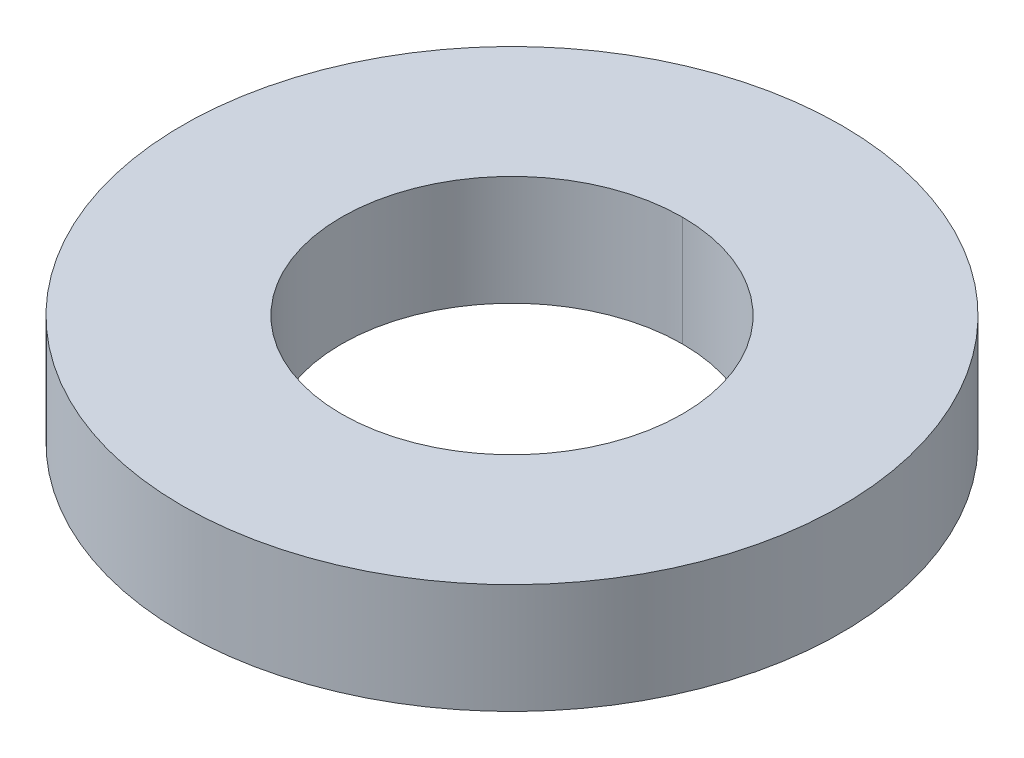
ISO-10303-21;
HEADER;
FILE_DESCRIPTION(('STEP AP214'),'2;1');
FILE_NAME('part.step','',(''),(''),'','','');
FILE_SCHEMA(('AUTOMOTIVE_DESIGN { 1 0 10303 214 1 1 1 1 }'));
ENDSEC;
DATA;
#1=APPLICATION_CONTEXT('core data for automotive mechanical design processes');
#2=APPLICATION_PROTOCOL_DEFINITION('international standard','automotive_design',2000,#1);
#3=PRODUCT_CONTEXT('',#1,'mechanical');
#4=PRODUCT('Part','Part','',(#3));
#5=PRODUCT_RELATED_PRODUCT_CATEGORY('part','',(#4));
#6=PRODUCT_DEFINITION_FORMATION('','',#4);
#7=PRODUCT_DEFINITION_CONTEXT('part definition',#1,'design');
#8=PRODUCT_DEFINITION('design','',#6,#7);
#9=PRODUCT_DEFINITION_SHAPE('','',#8);
#10=(LENGTH_UNIT() NAMED_UNIT(*) SI_UNIT(.MILLI.,.METRE.));
#11=(NAMED_UNIT(*) PLANE_ANGLE_UNIT() SI_UNIT($,.RADIAN.));
#12=(NAMED_UNIT(*) SI_UNIT($,.STERADIAN.) SOLID_ANGLE_UNIT());
#13=UNCERTAINTY_MEASURE_WITH_UNIT(LENGTH_MEASURE(1.E-05),#10,'distance_accuracy_value','');
#14=(GEOMETRIC_REPRESENTATION_CONTEXT(3) GLOBAL_UNCERTAINTY_ASSIGNED_CONTEXT((#13)) GLOBAL_UNIT_ASSIGNED_CONTEXT((#10,
#11,#12)) REPRESENTATION_CONTEXT('',''));
#15=CARTESIAN_POINT('',(0.,0.,0.));
#16=DIRECTION('',(0.,0.,1.));
#17=DIRECTION('',(1.,0.,0.));
#18=AXIS2_PLACEMENT_3D('',#15,#16,#17);
#19=CARTESIAN_POINT('',(0.,-1.5875,0.));
#20=DIRECTION('',(0.,1.,0.));
#21=DIRECTION('',(1.,0.,0.));
#22=AXIS2_PLACEMENT_3D('',#19,#20,#21);
#23=PLANE('',#22);
#24=CARTESIAN_POINT('',(0.,-1.5875,0.));
#25=DIRECTION('',(0.,1.,0.));
#26=DIRECTION('',(0.,0.,1.));
#27=AXIS2_PLACEMENT_3D('',#24,#25,#26);
#28=CIRCLE('',#27,2.4638);
#29=CARTESIAN_POINT('',(0.,-1.5875,-2.4638));
#30=VERTEX_POINT('',#29);
#31=CARTESIAN_POINT('',(0.,-1.5875,2.4638));
#32=VERTEX_POINT('',#31);
#33=EDGE_CURVE('E56',#30,#32,#28,.T.);
#34=ORIENTED_EDGE('',*,*,#33,.T.);
#35=CARTESIAN_POINT('',(0.,-1.5875,0.));
#36=DIRECTION('',(0.,1.,0.));
#37=DIRECTION('',(0.,0.,1.));
#38=AXIS2_PLACEMENT_3D('',#35,#36,#37);
#39=CIRCLE('',#38,2.4638);
#40=EDGE_CURVE('E93',#32,#30,#39,.T.);
#41=ORIENTED_EDGE('',*,*,#40,.T.);
#42=EDGE_LOOP('',(#34,#41));
#43=FACE_BOUND('',#42,.T.);
#44=CARTESIAN_POINT('',(0.,-1.5875,0.));
#45=DIRECTION('',(0.,1.,0.));
#46=DIRECTION('',(0.,0.,1.));
#47=AXIS2_PLACEMENT_3D('',#44,#45,#46);
#48=CIRCLE('',#47,4.7625);
#49=CARTESIAN_POINT('',(0.,-1.5875,4.7625));
#50=VERTEX_POINT('',#49);
#51=EDGE_CURVE('E88',#50,#50,#48,.T.);
#52=ORIENTED_EDGE('',*,*,#51,.F.);
#53=EDGE_LOOP('',(#52));
#54=FACE_BOUND('',#53,.T.);
#55=ADVANCED_FACE('F48',(#43,#54),#23,.F.);
#56=CARTESIAN_POINT('',(0.,1.5875,0.));
#57=DIRECTION('',(0.,-1.,0.));
#58=DIRECTION('',(0.,0.,-1.));
#59=AXIS2_PLACEMENT_3D('',#56,#57,#58);
#60=CYLINDRICAL_SURFACE('',#59,2.4638);
#61=DIRECTION('',(0.,-1.,0.));
#62=VECTOR('',#61,1.);
#63=CARTESIAN_POINT('',(0.,1.5875,2.4638));
#64=LINE('',#63,#62);
#65=CARTESIAN_POINT('',(0.,0.,2.4638));
#66=VERTEX_POINT('',#65);
#67=EDGE_CURVE('E72',#66,#32,#64,.T.);
#68=ORIENTED_EDGE('',*,*,#67,.F.);
#69=CARTESIAN_POINT('',(0.,0.,0.));
#70=DIRECTION('',(0.,-1.,0.));
#71=DIRECTION('',(0.,0.,-1.));
#72=AXIS2_PLACEMENT_3D('',#69,#70,#71);
#73=CIRCLE('',#72,2.4638);
#74=CARTESIAN_POINT('',(0.,0.,-2.4638));
#75=VERTEX_POINT('',#74);
#76=EDGE_CURVE('E62',#66,#75,#73,.F.);
#77=ORIENTED_EDGE('',*,*,#76,.T.);
#78=DIRECTION('',(0.,-1.,0.));
#79=VECTOR('',#78,1.);
#80=CARTESIAN_POINT('',(0.,1.5875,-2.4638));
#81=LINE('',#80,#79);
#82=EDGE_CURVE('E85',#75,#30,#81,.T.);
#83=ORIENTED_EDGE('',*,*,#82,.T.);
#84=ORIENTED_EDGE('',*,*,#40,.F.);
#85=EDGE_LOOP('',(#68,#77,#83,#84));
#86=FACE_BOUND('',#85,.T.);
#87=ADVANCED_FACE('F84',(#86),#60,.F.);
#88=CARTESIAN_POINT('',(0.,1.5875,0.));
#89=DIRECTION('',(0.,-1.,0.));
#90=DIRECTION('',(0.,0.,-1.));
#91=AXIS2_PLACEMENT_3D('',#88,#89,#90);
#92=CYLINDRICAL_SURFACE('',#91,2.4638);
#93=ORIENTED_EDGE('',*,*,#82,.F.);
#94=CARTESIAN_POINT('',(0.,0.,0.));
#95=DIRECTION('',(0.,-1.,0.));
#96=DIRECTION('',(0.,0.,-1.));
#97=AXIS2_PLACEMENT_3D('',#94,#95,#96);
#98=CIRCLE('',#97,2.4638);
#99=EDGE_CURVE('E78',#75,#66,#98,.F.);
#100=ORIENTED_EDGE('',*,*,#99,.T.);
#101=ORIENTED_EDGE('',*,*,#67,.T.);
#102=ORIENTED_EDGE('',*,*,#33,.F.);
#103=EDGE_LOOP('',(#93,#100,#101,#102));
#104=FACE_BOUND('',#103,.T.);
#105=ADVANCED_FACE('F90',(#104),#92,.F.);
#106=CARTESIAN_POINT('',(0.,-1.5875,0.));
#107=DIRECTION('',(0.,1.,0.));
#108=DIRECTION('',(0.,0.,1.));
#109=AXIS2_PLACEMENT_3D('',#106,#107,#108);
#110=CYLINDRICAL_SURFACE('',#109,4.7625);
#111=CARTESIAN_POINT('',(0.,0.,0.));
#112=DIRECTION('',(0.,-1.,0.));
#113=DIRECTION('',(0.,0.,-1.));
#114=AXIS2_PLACEMENT_3D('',#111,#112,#113);
#115=CIRCLE('',#114,4.7625);
#116=CARTESIAN_POINT('',(0.,0.,-4.7625));
#117=VERTEX_POINT('',#116);
#118=EDGE_CURVE('E11',#117,#117,#115,.F.);
#119=ORIENTED_EDGE('',*,*,#118,.F.);
#120=EDGE_LOOP('',(#119));
#121=FACE_BOUND('',#120,.T.);
#122=ORIENTED_EDGE('',*,*,#51,.T.);
#123=EDGE_LOOP('',(#122));
#124=FACE_BOUND('',#123,.T.);
#125=ADVANCED_FACE('F109',(#121,#124),#110,.T.);
#126=CARTESIAN_POINT('',(-4.7625,0.,6.11575637599101));
#127=DIRECTION('',(0.,-1.,0.));
#128=DIRECTION('',(0.,0.,-1.));
#129=AXIS2_PLACEMENT_3D('',#126,#127,#128);
#130=PLANE('',#129);
#131=ORIENTED_EDGE('',*,*,#118,.T.);
#132=EDGE_LOOP('',(#131));
#133=FACE_BOUND('',#132,.T.);
#134=ORIENTED_EDGE('',*,*,#99,.F.);
#135=ORIENTED_EDGE('',*,*,#76,.F.);
#136=EDGE_LOOP('',(#134,#135));
#137=FACE_BOUND('',#136,.T.);
#138=ADVANCED_FACE('F79',(#133,#137),#130,.F.);
#139=CLOSED_SHELL('',(#55,#87,#105,#125,#138));
#140=MANIFOLD_SOLID_BREP('B2',#139);
#141=ADVANCED_BREP_SHAPE_REPRESENTATION('',(#18,#140),#14);
#142=SHAPE_DEFINITION_REPRESENTATION(#9,#141);
ENDSEC;
END-ISO-10303-21;
